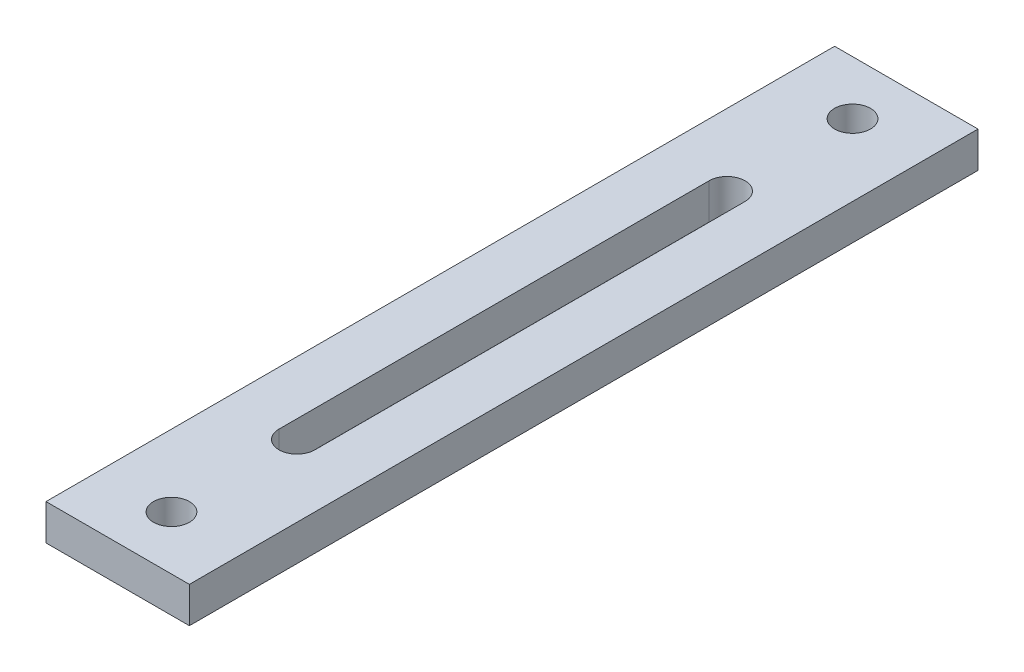
ISO-10303-21;
HEADER;
FILE_DESCRIPTION(('STEP AP214'),'2;1');
FILE_NAME('part.step','',(''),(''),'','','');
FILE_SCHEMA(('AUTOMOTIVE_DESIGN { 1 0 10303 214 1 1 1 1 }'));
ENDSEC;
DATA;
#1=APPLICATION_CONTEXT('core data for automotive mechanical design processes');
#2=APPLICATION_PROTOCOL_DEFINITION('international standard','automotive_design',2000,#1);
#3=PRODUCT_CONTEXT('',#1,'mechanical');
#4=PRODUCT('Part','Part','',(#3));
#5=PRODUCT_RELATED_PRODUCT_CATEGORY('part','',(#4));
#6=PRODUCT_DEFINITION_FORMATION('','',#4);
#7=PRODUCT_DEFINITION_CONTEXT('part definition',#1,'design');
#8=PRODUCT_DEFINITION('design','',#6,#7);
#9=PRODUCT_DEFINITION_SHAPE('','',#8);
#10=(LENGTH_UNIT() NAMED_UNIT(*) SI_UNIT(.MILLI.,.METRE.));
#11=(NAMED_UNIT(*) PLANE_ANGLE_UNIT() SI_UNIT($,.RADIAN.));
#12=(NAMED_UNIT(*) SI_UNIT($,.STERADIAN.) SOLID_ANGLE_UNIT());
#13=UNCERTAINTY_MEASURE_WITH_UNIT(LENGTH_MEASURE(1.E-05),#10,'distance_accuracy_value','');
#14=(GEOMETRIC_REPRESENTATION_CONTEXT(3) GLOBAL_UNCERTAINTY_ASSIGNED_CONTEXT((#13)) GLOBAL_UNIT_ASSIGNED_CONTEXT((#10,
#11,#12)) REPRESENTATION_CONTEXT('',''));
#15=CARTESIAN_POINT('',(0.,0.,0.));
#16=DIRECTION('',(0.,0.,1.));
#17=DIRECTION('',(1.,0.,0.));
#18=AXIS2_PLACEMENT_3D('',#15,#16,#17);
#19=CARTESIAN_POINT('',(0.,6.35,0.));
#20=DIRECTION('',(0.,-1.,0.));
#21=DIRECTION('',(0.,0.,-1.));
#22=AXIS2_PLACEMENT_3D('',#19,#20,#21);
#23=PLANE('',#22);
#24=DIRECTION('',(0.,0.,-1.));
#25=VECTOR('',#24,1.);
#26=CARTESIAN_POINT('',(12.7,6.35,69.85));
#27=LINE('',#26,#25);
#28=CARTESIAN_POINT('',(12.7,6.35,69.85));
#29=VERTEX_POINT('',#28);
#30=CARTESIAN_POINT('',(12.7,6.35,-69.85));
#31=VERTEX_POINT('',#30);
#32=EDGE_CURVE('E137',#29,#31,#27,.T.);
#33=ORIENTED_EDGE('',*,*,#32,.T.);
#34=DIRECTION('',(-1.,0.,0.));
#35=VECTOR('',#34,1.);
#36=CARTESIAN_POINT('',(-12.7,6.35,-69.85));
#37=LINE('',#36,#35);
#38=CARTESIAN_POINT('',(-12.7,6.35,-69.85));
#39=VERTEX_POINT('',#38);
#40=EDGE_CURVE('E140',#31,#39,#37,.T.);
#41=ORIENTED_EDGE('',*,*,#40,.T.);
#42=DIRECTION('',(0.,0.,1.));
#43=VECTOR('',#42,1.);
#44=CARTESIAN_POINT('',(-12.7,6.35,69.85));
#45=LINE('',#44,#43);
#46=CARTESIAN_POINT('',(-12.7,6.35,69.85));
#47=VERTEX_POINT('',#46);
#48=EDGE_CURVE('E143',#39,#47,#45,.T.);
#49=ORIENTED_EDGE('',*,*,#48,.T.);
#50=DIRECTION('',(1.,0.,0.));
#51=VECTOR('',#50,1.);
#52=CARTESIAN_POINT('',(-12.7,6.35,69.85));
#53=LINE('',#52,#51);
#54=EDGE_CURVE('E145',#47,#29,#53,.T.);
#55=ORIENTED_EDGE('',*,*,#54,.T.);
#56=EDGE_LOOP('',(#33,#41,#49,#55));
#57=FACE_BOUND('',#56,.T.);
#58=CARTESIAN_POINT('',(0.,6.35,38.1));
#59=DIRECTION('',(0.,1.,0.));
#60=DIRECTION('',(0.,0.,1.));
#61=AXIS2_PLACEMENT_3D('',#58,#59,#60);
#62=CIRCLE('',#61,3.18262);
#63=CARTESIAN_POINT('',(-3.18262,6.35,38.1));
#64=VERTEX_POINT('',#63);
#65=CARTESIAN_POINT('',(3.18262,6.35,38.1));
#66=VERTEX_POINT('',#65);
#67=EDGE_CURVE('E98',#64,#66,#62,.T.);
#68=ORIENTED_EDGE('',*,*,#67,.F.);
#69=DIRECTION('',(0.,0.,1.));
#70=VECTOR('',#69,1.);
#71=CARTESIAN_POINT('',(-3.18262,6.35,38.1));
#72=LINE('',#71,#70);
#73=CARTESIAN_POINT('',(-3.18262000000001,6.35,-38.1));
#74=VERTEX_POINT('',#73);
#75=EDGE_CURVE('E121',#74,#64,#72,.T.);
#76=ORIENTED_EDGE('',*,*,#75,.F.);
#77=CARTESIAN_POINT('',(0.,6.35,-38.1));
#78=DIRECTION('',(0.,1.,0.));
#79=DIRECTION('',(0.,0.,1.));
#80=AXIS2_PLACEMENT_3D('',#77,#78,#79);
#81=CIRCLE('',#80,3.18262);
#82=CARTESIAN_POINT('',(3.18261999999999,6.35,-38.1));
#83=VERTEX_POINT('',#82);
#84=EDGE_CURVE('E119',#83,#74,#81,.T.);
#85=ORIENTED_EDGE('',*,*,#84,.F.);
#86=DIRECTION('',(0.,0.,-1.));
#87=VECTOR('',#86,1.);
#88=CARTESIAN_POINT('',(3.18262,6.35,38.1));
#89=LINE('',#88,#87);
#90=EDGE_CURVE('E106',#66,#83,#89,.T.);
#91=ORIENTED_EDGE('',*,*,#90,.F.);
#92=EDGE_LOOP('',(#68,#76,#85,#91));
#93=FACE_BOUND('',#92,.T.);
#94=CARTESIAN_POINT('',(0.,6.35,-60.325));
#95=DIRECTION('',(0.,1.,0.));
#96=DIRECTION('',(0.,0.,1.));
#97=AXIS2_PLACEMENT_3D('',#94,#95,#96);
#98=CIRCLE('',#97,3.18262);
#99=CARTESIAN_POINT('',(0.,6.35,-57.14238));
#100=VERTEX_POINT('',#99);
#101=EDGE_CURVE('E127',#100,#100,#98,.T.);
#102=ORIENTED_EDGE('',*,*,#101,.F.);
#103=EDGE_LOOP('',(#102));
#104=FACE_BOUND('',#103,.T.);
#105=CARTESIAN_POINT('',(0.,6.35,60.325));
#106=DIRECTION('',(0.,1.,0.));
#107=DIRECTION('',(0.,0.,1.));
#108=AXIS2_PLACEMENT_3D('',#105,#106,#107);
#109=CIRCLE('',#108,3.18262);
#110=CARTESIAN_POINT('',(0.,6.35,63.50762));
#111=VERTEX_POINT('',#110);
#112=EDGE_CURVE('E226',#111,#111,#109,.T.);
#113=ORIENTED_EDGE('',*,*,#112,.F.);
#114=EDGE_LOOP('',(#113));
#115=FACE_BOUND('',#114,.T.);
#116=ADVANCED_FACE('F33',(#57,#93,#104,#115),#23,.F.);
#117=CARTESIAN_POINT('',(0.,0.,0.));
#118=DIRECTION('',(0.,-1.,0.));
#119=DIRECTION('',(0.,0.,-1.));
#120=AXIS2_PLACEMENT_3D('',#117,#118,#119);
#121=PLANE('',#120);
#122=CARTESIAN_POINT('',(0.,0.,-60.325));
#123=DIRECTION('',(0.,1.,0.));
#124=DIRECTION('',(0.,0.,1.));
#125=AXIS2_PLACEMENT_3D('',#122,#123,#124);
#126=CIRCLE('',#125,3.18262);
#127=CARTESIAN_POINT('',(0.,0.,-57.14238));
#128=VERTEX_POINT('',#127);
#129=EDGE_CURVE('E232',#128,#128,#126,.T.);
#130=ORIENTED_EDGE('',*,*,#129,.T.);
#131=EDGE_LOOP('',(#130));
#132=FACE_BOUND('',#131,.T.);
#133=DIRECTION('',(0.,0.,-1.));
#134=VECTOR('',#133,1.);
#135=CARTESIAN_POINT('',(12.7,0.,69.85));
#136=LINE('',#135,#134);
#137=CARTESIAN_POINT('',(12.7,0.,69.85));
#138=VERTEX_POINT('',#137);
#139=CARTESIAN_POINT('',(12.7,0.,-69.85));
#140=VERTEX_POINT('',#139);
#141=EDGE_CURVE('E114',#138,#140,#136,.T.);
#142=ORIENTED_EDGE('',*,*,#141,.F.);
#143=DIRECTION('',(1.,0.,0.));
#144=VECTOR('',#143,1.);
#145=CARTESIAN_POINT('',(-12.7,0.,69.85));
#146=LINE('',#145,#144);
#147=CARTESIAN_POINT('',(-12.7,0.,69.85));
#148=VERTEX_POINT('',#147);
#149=EDGE_CURVE('E141',#148,#138,#146,.T.);
#150=ORIENTED_EDGE('',*,*,#149,.F.);
#151=DIRECTION('',(0.,0.,1.));
#152=VECTOR('',#151,1.);
#153=CARTESIAN_POINT('',(-12.7,0.,69.85));
#154=LINE('',#153,#152);
#155=CARTESIAN_POINT('',(-12.7,0.,-69.85));
#156=VERTEX_POINT('',#155);
#157=EDGE_CURVE('E152',#156,#148,#154,.T.);
#158=ORIENTED_EDGE('',*,*,#157,.F.);
#159=DIRECTION('',(-1.,0.,0.));
#160=VECTOR('',#159,1.);
#161=CARTESIAN_POINT('',(-12.7,0.,-69.85));
#162=LINE('',#161,#160);
#163=EDGE_CURVE('E150',#140,#156,#162,.T.);
#164=ORIENTED_EDGE('',*,*,#163,.F.);
#165=EDGE_LOOP('',(#142,#150,#158,#164));
#166=FACE_BOUND('',#165,.T.);
#167=DIRECTION('',(0.,0.,1.));
#168=VECTOR('',#167,1.);
#169=CARTESIAN_POINT('',(-3.18262,0.,38.1));
#170=LINE('',#169,#168);
#171=CARTESIAN_POINT('',(-3.18262000000001,0.,-38.1));
#172=VERTEX_POINT('',#171);
#173=CARTESIAN_POINT('',(-3.18262,0.,38.1));
#174=VERTEX_POINT('',#173);
#175=EDGE_CURVE('E107',#172,#174,#170,.T.);
#176=ORIENTED_EDGE('',*,*,#175,.T.);
#177=CARTESIAN_POINT('',(0.,0.,38.1));
#178=DIRECTION('',(0.,1.,0.));
#179=DIRECTION('',(0.,0.,1.));
#180=AXIS2_PLACEMENT_3D('',#177,#178,#179);
#181=CIRCLE('',#180,3.18262);
#182=CARTESIAN_POINT('',(3.18262,0.,38.1));
#183=VERTEX_POINT('',#182);
#184=EDGE_CURVE('E56',#174,#183,#181,.T.);
#185=ORIENTED_EDGE('',*,*,#184,.T.);
#186=DIRECTION('',(0.,0.,-1.));
#187=VECTOR('',#186,1.);
#188=CARTESIAN_POINT('',(3.18262,0.,38.1));
#189=LINE('',#188,#187);
#190=CARTESIAN_POINT('',(3.18261999999999,0.,-38.1));
#191=VERTEX_POINT('',#190);
#192=EDGE_CURVE('E113',#183,#191,#189,.T.);
#193=ORIENTED_EDGE('',*,*,#192,.T.);
#194=CARTESIAN_POINT('',(0.,0.,-38.1));
#195=DIRECTION('',(0.,1.,0.));
#196=DIRECTION('',(0.,0.,1.));
#197=AXIS2_PLACEMENT_3D('',#194,#195,#196);
#198=CIRCLE('',#197,3.18262);
#199=EDGE_CURVE('E129',#191,#172,#198,.T.);
#200=ORIENTED_EDGE('',*,*,#199,.T.);
#201=EDGE_LOOP('',(#176,#185,#193,#200));
#202=FACE_BOUND('',#201,.T.);
#203=CARTESIAN_POINT('',(0.,0.,60.325));
#204=DIRECTION('',(0.,1.,0.));
#205=DIRECTION('',(0.,0.,1.));
#206=AXIS2_PLACEMENT_3D('',#203,#204,#205);
#207=CIRCLE('',#206,3.18262);
#208=CARTESIAN_POINT('',(0.,0.,63.50762));
#209=VERTEX_POINT('',#208);
#210=EDGE_CURVE('E229',#209,#209,#207,.T.);
#211=ORIENTED_EDGE('',*,*,#210,.T.);
#212=EDGE_LOOP('',(#211));
#213=FACE_BOUND('',#212,.T.);
#214=ADVANCED_FACE('F170',(#132,#166,#202,#213),#121,.T.);
#215=CARTESIAN_POINT('',(12.7,6.35,69.85));
#216=DIRECTION('',(-1.,0.,0.));
#217=DIRECTION('',(0.,0.,1.));
#218=AXIS2_PLACEMENT_3D('',#215,#216,#217);
#219=PLANE('',#218);
#220=ORIENTED_EDGE('',*,*,#141,.T.);
#221=DIRECTION('',(0.,-1.,0.));
#222=VECTOR('',#221,1.);
#223=CARTESIAN_POINT('',(12.7,6.35,-69.85));
#224=LINE('',#223,#222);
#225=EDGE_CURVE('E11',#31,#140,#224,.T.);
#226=ORIENTED_EDGE('',*,*,#225,.F.);
#227=ORIENTED_EDGE('',*,*,#32,.F.);
#228=DIRECTION('',(0.,-1.,0.));
#229=VECTOR('',#228,1.);
#230=CARTESIAN_POINT('',(12.7,6.35,69.85));
#231=LINE('',#230,#229);
#232=EDGE_CURVE('E147',#29,#138,#231,.T.);
#233=ORIENTED_EDGE('',*,*,#232,.T.);
#234=EDGE_LOOP('',(#220,#226,#227,#233));
#235=FACE_BOUND('',#234,.T.);
#236=ADVANCED_FACE('F35',(#235),#219,.F.);
#237=CARTESIAN_POINT('',(-12.7,6.35,-69.85));
#238=DIRECTION('',(0.,0.,1.));
#239=DIRECTION('',(1.,0.,0.));
#240=AXIS2_PLACEMENT_3D('',#237,#238,#239);
#241=PLANE('',#240);
#242=ORIENTED_EDGE('',*,*,#163,.T.);
#243=DIRECTION('',(0.,-1.,0.));
#244=VECTOR('',#243,1.);
#245=CARTESIAN_POINT('',(-12.7,6.35,-69.85));
#246=LINE('',#245,#244);
#247=EDGE_CURVE('E41',#39,#156,#246,.T.);
#248=ORIENTED_EDGE('',*,*,#247,.F.);
#249=ORIENTED_EDGE('',*,*,#40,.F.);
#250=ORIENTED_EDGE('',*,*,#225,.T.);
#251=EDGE_LOOP('',(#242,#248,#249,#250));
#252=FACE_BOUND('',#251,.T.);
#253=ADVANCED_FACE('F180',(#252),#241,.F.);
#254=CARTESIAN_POINT('',(-12.7,6.35,69.85));
#255=DIRECTION('',(1.,0.,0.));
#256=DIRECTION('',(0.,0.,-1.));
#257=AXIS2_PLACEMENT_3D('',#254,#255,#256);
#258=PLANE('',#257);
#259=ORIENTED_EDGE('',*,*,#157,.T.);
#260=DIRECTION('',(0.,-1.,0.));
#261=VECTOR('',#260,1.);
#262=CARTESIAN_POINT('',(-12.7,6.35,69.85));
#263=LINE('',#262,#261);
#264=EDGE_CURVE('E157',#47,#148,#263,.T.);
#265=ORIENTED_EDGE('',*,*,#264,.F.);
#266=ORIENTED_EDGE('',*,*,#48,.F.);
#267=ORIENTED_EDGE('',*,*,#247,.T.);
#268=EDGE_LOOP('',(#259,#265,#266,#267));
#269=FACE_BOUND('',#268,.T.);
#270=ADVANCED_FACE('F164',(#269),#258,.F.);
#271=CARTESIAN_POINT('',(-12.7,6.35,69.85));
#272=DIRECTION('',(0.,0.,-1.));
#273=DIRECTION('',(-1.,0.,0.));
#274=AXIS2_PLACEMENT_3D('',#271,#272,#273);
#275=PLANE('',#274);
#276=ORIENTED_EDGE('',*,*,#149,.T.);
#277=ORIENTED_EDGE('',*,*,#232,.F.);
#278=ORIENTED_EDGE('',*,*,#54,.F.);
#279=ORIENTED_EDGE('',*,*,#264,.T.);
#280=EDGE_LOOP('',(#276,#277,#278,#279));
#281=FACE_BOUND('',#280,.T.);
#282=ADVANCED_FACE('F174',(#281),#275,.F.);
#283=CARTESIAN_POINT('',(0.,6.35,38.1));
#284=DIRECTION('',(0.,-1.,0.));
#285=DIRECTION('',(0.,0.,-1.));
#286=AXIS2_PLACEMENT_3D('',#283,#284,#285);
#287=CYLINDRICAL_SURFACE('',#286,3.18262);
#288=ORIENTED_EDGE('',*,*,#184,.F.);
#289=DIRECTION('',(0.,-1.,0.));
#290=VECTOR('',#289,1.);
#291=CARTESIAN_POINT('',(-3.18262,6.35,38.1));
#292=LINE('',#291,#290);
#293=EDGE_CURVE('E102',#64,#174,#292,.T.);
#294=ORIENTED_EDGE('',*,*,#293,.F.);
#295=ORIENTED_EDGE('',*,*,#67,.T.);
#296=DIRECTION('',(0.,-1.,0.));
#297=VECTOR('',#296,1.);
#298=CARTESIAN_POINT('',(3.18262,6.35,38.1));
#299=LINE('',#298,#297);
#300=EDGE_CURVE('E101',#66,#183,#299,.T.);
#301=ORIENTED_EDGE('',*,*,#300,.T.);
#302=EDGE_LOOP('',(#288,#294,#295,#301));
#303=FACE_BOUND('',#302,.T.);
#304=ADVANCED_FACE('F100',(#303),#287,.F.);
#305=CARTESIAN_POINT('',(3.18262,6.35,38.1));
#306=DIRECTION('',(-1.,0.,0.));
#307=DIRECTION('',(0.,0.,1.));
#308=AXIS2_PLACEMENT_3D('',#305,#306,#307);
#309=PLANE('',#308);
#310=ORIENTED_EDGE('',*,*,#192,.F.);
#311=ORIENTED_EDGE('',*,*,#300,.F.);
#312=ORIENTED_EDGE('',*,*,#90,.T.);
#313=DIRECTION('',(0.,-1.,0.));
#314=VECTOR('',#313,1.);
#315=CARTESIAN_POINT('',(3.18261999999999,6.35,-38.1));
#316=LINE('',#315,#314);
#317=EDGE_CURVE('E115',#83,#191,#316,.T.);
#318=ORIENTED_EDGE('',*,*,#317,.T.);
#319=EDGE_LOOP('',(#310,#311,#312,#318));
#320=FACE_BOUND('',#319,.T.);
#321=ADVANCED_FACE('F110',(#320),#309,.T.);
#322=CARTESIAN_POINT('',(0.,6.35,-38.1));
#323=DIRECTION('',(0.,-1.,0.));
#324=DIRECTION('',(0.,0.,-1.));
#325=AXIS2_PLACEMENT_3D('',#322,#323,#324);
#326=CYLINDRICAL_SURFACE('',#325,3.18262);
#327=ORIENTED_EDGE('',*,*,#199,.F.);
#328=ORIENTED_EDGE('',*,*,#317,.F.);
#329=ORIENTED_EDGE('',*,*,#84,.T.);
#330=DIRECTION('',(0.,-1.,0.));
#331=VECTOR('',#330,1.);
#332=CARTESIAN_POINT('',(-3.18262000000001,6.35,-38.1));
#333=LINE('',#332,#331);
#334=EDGE_CURVE('E48',#74,#172,#333,.T.);
#335=ORIENTED_EDGE('',*,*,#334,.T.);
#336=EDGE_LOOP('',(#327,#328,#329,#335));
#337=FACE_BOUND('',#336,.T.);
#338=ADVANCED_FACE('F204',(#337),#326,.F.);
#339=CARTESIAN_POINT('',(-3.18262,6.35,38.1));
#340=DIRECTION('',(1.,0.,0.));
#341=DIRECTION('',(0.,0.,-1.));
#342=AXIS2_PLACEMENT_3D('',#339,#340,#341);
#343=PLANE('',#342);
#344=ORIENTED_EDGE('',*,*,#175,.F.);
#345=ORIENTED_EDGE('',*,*,#334,.F.);
#346=ORIENTED_EDGE('',*,*,#75,.T.);
#347=ORIENTED_EDGE('',*,*,#293,.T.);
#348=EDGE_LOOP('',(#344,#345,#346,#347));
#349=FACE_BOUND('',#348,.T.);
#350=ADVANCED_FACE('F208',(#349),#343,.T.);
#351=CARTESIAN_POINT('',(0.,6.35,-60.325));
#352=DIRECTION('',(0.,-1.,0.));
#353=DIRECTION('',(0.,0.,-1.));
#354=AXIS2_PLACEMENT_3D('',#351,#352,#353);
#355=CYLINDRICAL_SURFACE('',#354,3.18262);
#356=ORIENTED_EDGE('',*,*,#101,.T.);
#357=EDGE_LOOP('',(#356));
#358=FACE_BOUND('',#357,.T.);
#359=ORIENTED_EDGE('',*,*,#129,.F.);
#360=EDGE_LOOP('',(#359));
#361=FACE_BOUND('',#360,.T.);
#362=ADVANCED_FACE('F214',(#358,#361),#355,.F.);
#363=CARTESIAN_POINT('',(0.,6.35,60.325));
#364=DIRECTION('',(0.,-1.,0.));
#365=DIRECTION('',(0.,0.,-1.));
#366=AXIS2_PLACEMENT_3D('',#363,#364,#365);
#367=CYLINDRICAL_SURFACE('',#366,3.18262);
#368=ORIENTED_EDGE('',*,*,#112,.T.);
#369=EDGE_LOOP('',(#368));
#370=FACE_BOUND('',#369,.T.);
#371=ORIENTED_EDGE('',*,*,#210,.F.);
#372=EDGE_LOOP('',(#371));
#373=FACE_BOUND('',#372,.T.);
#374=ADVANCED_FACE('F217',(#370,#373),#367,.F.);
#375=CLOSED_SHELL('',(#116,#214,#236,#253,#270,#282,#304,#321,#338,#350,#362,#374));
#376=MANIFOLD_SOLID_BREP('B2',#375);
#377=ADVANCED_BREP_SHAPE_REPRESENTATION('',(#18,#376),#14);
#378=SHAPE_DEFINITION_REPRESENTATION(#9,#377);
ENDSEC;
END-ISO-10303-21;
